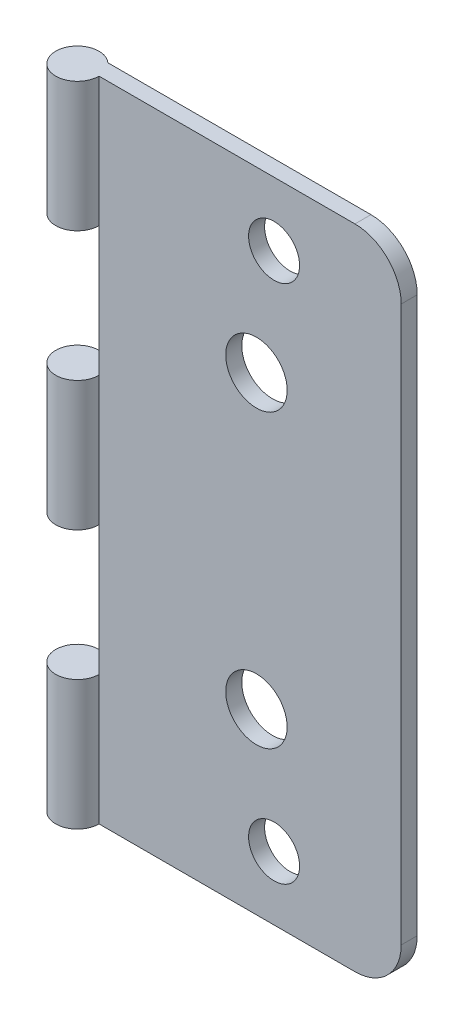
ISO-10303-21;
HEADER;
FILE_DESCRIPTION(('STEP AP214'),'2;1');
FILE_NAME('part.step','',(''),(''),'','','');
FILE_SCHEMA(('AUTOMOTIVE_DESIGN { 1 0 10303 214 1 1 1 1 }'));
ENDSEC;
DATA;
#1=APPLICATION_CONTEXT('core data for automotive mechanical design processes');
#2=APPLICATION_PROTOCOL_DEFINITION('international standard','automotive_design',2000,#1);
#3=PRODUCT_CONTEXT('',#1,'mechanical');
#4=PRODUCT('Part','Part','',(#3));
#5=PRODUCT_RELATED_PRODUCT_CATEGORY('part','',(#4));
#6=PRODUCT_DEFINITION_FORMATION('','',#4);
#7=PRODUCT_DEFINITION_CONTEXT('part definition',#1,'design');
#8=PRODUCT_DEFINITION('design','',#6,#7);
#9=PRODUCT_DEFINITION_SHAPE('','',#8);
#10=(LENGTH_UNIT() NAMED_UNIT(*) SI_UNIT(.MILLI.,.METRE.));
#11=(NAMED_UNIT(*) PLANE_ANGLE_UNIT() SI_UNIT($,.RADIAN.));
#12=(NAMED_UNIT(*) SI_UNIT($,.STERADIAN.) SOLID_ANGLE_UNIT());
#13=UNCERTAINTY_MEASURE_WITH_UNIT(LENGTH_MEASURE(1.E-05),#10,'distance_accuracy_value','');
#14=(GEOMETRIC_REPRESENTATION_CONTEXT(3) GLOBAL_UNCERTAINTY_ASSIGNED_CONTEXT((#13)) GLOBAL_UNIT_ASSIGNED_CONTEXT((#10,
#11,#12)) REPRESENTATION_CONTEXT('',''));
#15=CARTESIAN_POINT('',(0.,0.,0.));
#16=DIRECTION('',(0.,0.,1.));
#17=DIRECTION('',(1.,0.,0.));
#18=AXIS2_PLACEMENT_3D('',#15,#16,#17);
#19=CARTESIAN_POINT('',(0.,44.45,0.));
#20=DIRECTION('',(0.,-1.,0.));
#21=DIRECTION('',(0.,0.,-1.));
#22=AXIS2_PLACEMENT_3D('',#19,#20,#21);
#23=CYLINDRICAL_SURFACE('',#22,2.97);
#24=CARTESIAN_POINT('',(0.,8.89,0.));
#25=DIRECTION('',(0.,-1.,0.));
#26=DIRECTION('',(0.,0.,-1.));
#27=AXIS2_PLACEMENT_3D('',#24,#25,#26);
#28=CIRCLE('',#27,2.97);
#29=CARTESIAN_POINT('',(2.97,8.89,0.));
#30=VERTEX_POINT('',#29);
#31=CARTESIAN_POINT('',(1.99521928619388,8.89,-2.2));
#32=VERTEX_POINT('',#31);
#33=EDGE_CURVE('E237',#30,#32,#28,.T.);
#34=ORIENTED_EDGE('',*,*,#33,.T.);
#35=DIRECTION('',(0.,-1.,0.));
#36=VECTOR('',#35,1.);
#37=CARTESIAN_POINT('',(1.99521928619388,44.45,-2.2));
#38=LINE('',#37,#36);
#39=CARTESIAN_POINT('',(1.99521928619388,-8.89,-2.2));
#40=VERTEX_POINT('',#39);
#41=EDGE_CURVE('E266',#32,#40,#38,.T.);
#42=ORIENTED_EDGE('',*,*,#41,.T.);
#43=CARTESIAN_POINT('',(0.,-8.89,0.));
#44=DIRECTION('',(0.,1.,0.));
#45=DIRECTION('',(0.,0.,1.));
#46=AXIS2_PLACEMENT_3D('',#43,#44,#45);
#47=CIRCLE('',#46,2.97);
#48=CARTESIAN_POINT('',(2.97,-8.89,0.));
#49=VERTEX_POINT('',#48);
#50=EDGE_CURVE('E154',#40,#49,#47,.T.);
#51=ORIENTED_EDGE('',*,*,#50,.T.);
#52=DIRECTION('',(0.,-1.,0.));
#53=VECTOR('',#52,1.);
#54=CARTESIAN_POINT('',(2.97,44.45,0.));
#55=LINE('',#54,#53);
#56=EDGE_CURVE('E268',#30,#49,#55,.T.);
#57=ORIENTED_EDGE('',*,*,#56,.F.);
#58=EDGE_LOOP('',(#34,#42,#51,#57));
#59=FACE_BOUND('',#58,.T.);
#60=ADVANCED_FACE('F54',(#59),#23,.T.);
#61=CARTESIAN_POINT('',(0.,26.67,0.));
#62=DIRECTION('',(0.,1.,0.));
#63=DIRECTION('',(0.,0.,1.));
#64=AXIS2_PLACEMENT_3D('',#61,#62,#63);
#65=CIRCLE('',#64,2.97);
#66=CARTESIAN_POINT('',(1.99521928619388,26.67,-2.2));
#67=VERTEX_POINT('',#66);
#68=CARTESIAN_POINT('',(2.97,26.67,0.));
#69=VERTEX_POINT('',#68);
#70=EDGE_CURVE('E235',#67,#69,#65,.T.);
#71=ORIENTED_EDGE('',*,*,#70,.T.);
#72=CARTESIAN_POINT('',(2.97,44.45,0.));
#73=VERTEX_POINT('',#72);
#74=EDGE_CURVE('E160',#73,#69,#55,.T.);
#75=ORIENTED_EDGE('',*,*,#74,.F.);
#76=CARTESIAN_POINT('',(0.,44.45,0.));
#77=DIRECTION('',(0.,1.,0.));
#78=DIRECTION('',(0.,0.,1.));
#79=AXIS2_PLACEMENT_3D('',#76,#77,#78);
#80=CIRCLE('',#79,2.97);
#81=CARTESIAN_POINT('',(1.99521928619388,44.45,-2.2));
#82=VERTEX_POINT('',#81);
#83=EDGE_CURVE('E243',#82,#73,#80,.T.);
#84=ORIENTED_EDGE('',*,*,#83,.F.);
#85=EDGE_CURVE('E263',#82,#67,#38,.T.);
#86=ORIENTED_EDGE('',*,*,#85,.T.);
#87=EDGE_LOOP('',(#71,#75,#84,#86));
#88=FACE_BOUND('',#87,.T.);
#89=ADVANCED_FACE('F293',(#88),#23,.T.);
#90=CARTESIAN_POINT('',(0.,-26.67,0.));
#91=DIRECTION('',(0.,-1.,0.));
#92=DIRECTION('',(0.,0.,-1.));
#93=AXIS2_PLACEMENT_3D('',#90,#91,#92);
#94=CIRCLE('',#93,2.97);
#95=CARTESIAN_POINT('',(2.97,-26.67,0.));
#96=VERTEX_POINT('',#95);
#97=CARTESIAN_POINT('',(1.99521928619388,-26.67,-2.2));
#98=VERTEX_POINT('',#97);
#99=EDGE_CURVE('E232',#96,#98,#94,.T.);
#100=ORIENTED_EDGE('',*,*,#99,.T.);
#101=CARTESIAN_POINT('',(1.99521928619388,-44.45,-2.2));
#102=VERTEX_POINT('',#101);
#103=EDGE_CURVE('E246',#98,#102,#38,.T.);
#104=ORIENTED_EDGE('',*,*,#103,.T.);
#105=CARTESIAN_POINT('',(0.,-44.45,0.));
#106=DIRECTION('',(0.,1.,0.));
#107=DIRECTION('',(0.,0.,1.));
#108=AXIS2_PLACEMENT_3D('',#105,#106,#107);
#109=CIRCLE('',#108,2.97);
#110=CARTESIAN_POINT('',(2.97,-44.45,0.));
#111=VERTEX_POINT('',#110);
#112=EDGE_CURVE('E247',#102,#111,#109,.T.);
#113=ORIENTED_EDGE('',*,*,#112,.T.);
#114=EDGE_CURVE('E265',#96,#111,#55,.T.);
#115=ORIENTED_EDGE('',*,*,#114,.F.);
#116=EDGE_LOOP('',(#100,#104,#113,#115));
#117=FACE_BOUND('',#116,.T.);
#118=ADVANCED_FACE('F275',(#117),#23,.T.);
#119=CARTESIAN_POINT('',(0.,-44.45,0.));
#120=DIRECTION('',(0.,1.,0.));
#121=DIRECTION('',(0.,0.,1.));
#122=AXIS2_PLACEMENT_3D('',#119,#120,#121);
#123=PLANE('',#122);
#124=DIRECTION('',(1.,0.,0.));
#125=VECTOR('',#124,1.);
#126=CARTESIAN_POINT('',(0.,-44.45,-2.2));
#127=LINE('',#126,#125);
#128=CARTESIAN_POINT('',(38.1,-44.45,-2.2));
#129=VERTEX_POINT('',#128);
#130=EDGE_CURVE('E242',#102,#129,#127,.T.);
#131=ORIENTED_EDGE('',*,*,#130,.T.);
#132=DIRECTION('',(0.,0.,-1.));
#133=VECTOR('',#132,1.);
#134=CARTESIAN_POINT('',(38.1,-44.45,0.));
#135=LINE('',#134,#133);
#136=CARTESIAN_POINT('',(38.1,-44.45,0.));
#137=VERTEX_POINT('',#136);
#138=EDGE_CURVE('E79',#129,#137,#135,.F.);
#139=ORIENTED_EDGE('',*,*,#138,.T.);
#140=DIRECTION('',(1.,0.,0.));
#141=VECTOR('',#140,1.);
#142=CARTESIAN_POINT('',(0.,-44.45,0.));
#143=LINE('',#142,#141);
#144=EDGE_CURVE('E255',#111,#137,#143,.T.);
#145=ORIENTED_EDGE('',*,*,#144,.F.);
#146=ORIENTED_EDGE('',*,*,#112,.F.);
#147=EDGE_LOOP('',(#131,#139,#145,#146));
#148=FACE_BOUND('',#147,.T.);
#149=ADVANCED_FACE('F274',(#148),#123,.F.);
#150=CARTESIAN_POINT('',(0.,44.45,0.));
#151=DIRECTION('',(0.,1.,0.));
#152=DIRECTION('',(0.,0.,1.));
#153=AXIS2_PLACEMENT_3D('',#150,#151,#152);
#154=PLANE('',#153);
#155=DIRECTION('',(1.,0.,0.));
#156=VECTOR('',#155,1.);
#157=CARTESIAN_POINT('',(0.,44.45,0.));
#158=LINE('',#157,#156);
#159=CARTESIAN_POINT('',(38.1,44.45,0.));
#160=VERTEX_POINT('',#159);
#161=EDGE_CURVE('E254',#73,#160,#158,.T.);
#162=ORIENTED_EDGE('',*,*,#161,.T.);
#163=DIRECTION('',(0.,0.,-1.));
#164=VECTOR('',#163,1.);
#165=CARTESIAN_POINT('',(38.1,44.45,-2.2));
#166=LINE('',#165,#164);
#167=CARTESIAN_POINT('',(38.1,44.45,-2.2));
#168=VERTEX_POINT('',#167);
#169=EDGE_CURVE('E12',#160,#168,#166,.T.);
#170=ORIENTED_EDGE('',*,*,#169,.T.);
#171=DIRECTION('',(1.,0.,0.));
#172=VECTOR('',#171,1.);
#173=CARTESIAN_POINT('',(0.,44.45,-2.2));
#174=LINE('',#173,#172);
#175=EDGE_CURVE('E251',#82,#168,#174,.T.);
#176=ORIENTED_EDGE('',*,*,#175,.F.);
#177=ORIENTED_EDGE('',*,*,#83,.T.);
#178=EDGE_LOOP('',(#162,#170,#176,#177));
#179=FACE_BOUND('',#178,.T.);
#180=ADVANCED_FACE('F288',(#179),#154,.T.);
#181=CARTESIAN_POINT('',(0.,44.45,0.));
#182=DIRECTION('',(0.,0.,-1.));
#183=DIRECTION('',(-1.,0.,0.));
#184=AXIS2_PLACEMENT_3D('',#181,#182,#183);
#185=PLANE('',#184);
#186=CARTESIAN_POINT('',(24.58125,20.0103450185321,0.));
#187=DIRECTION('',(0.,0.,1.));
#188=DIRECTION('',(1.,0.,0.));
#189=AXIS2_PLACEMENT_3D('',#186,#187,#188);
#190=CIRCLE('',#189,4.21639999999999);
#191=CARTESIAN_POINT('',(28.79765,20.0103450185321,0.));
#192=VERTEX_POINT('',#191);
#193=EDGE_CURVE('E220',#192,#192,#190,.T.);
#194=ORIENTED_EDGE('',*,*,#193,.F.);
#195=EDGE_LOOP('',(#194));
#196=FACE_BOUND('',#195,.T.);
#197=CARTESIAN_POINT('',(24.58125,-20.0103450185321,0.));
#198=DIRECTION('',(0.,0.,1.));
#199=DIRECTION('',(1.,0.,0.));
#200=AXIS2_PLACEMENT_3D('',#197,#198,#199);
#201=CIRCLE('',#200,4.21639999999999);
#202=CARTESIAN_POINT('',(28.79765,-20.0103450185321,0.));
#203=VERTEX_POINT('',#202);
#204=EDGE_CURVE('E210',#203,#203,#201,.T.);
#205=ORIENTED_EDGE('',*,*,#204,.F.);
#206=EDGE_LOOP('',(#205));
#207=FACE_BOUND('',#206,.T.);
#208=CARTESIAN_POINT('',(27.,35.7,0.));
#209=DIRECTION('',(0.,0.,1.));
#210=DIRECTION('',(1.,0.,0.));
#211=AXIS2_PLACEMENT_3D('',#208,#209,#210);
#212=CIRCLE('',#211,3.5);
#213=CARTESIAN_POINT('',(30.5,35.7,0.));
#214=VERTEX_POINT('',#213);
#215=EDGE_CURVE('E205',#214,#214,#212,.T.);
#216=ORIENTED_EDGE('',*,*,#215,.F.);
#217=EDGE_LOOP('',(#216));
#218=FACE_BOUND('',#217,.T.);
#219=CARTESIAN_POINT('',(27.,-35.7,0.));
#220=DIRECTION('',(0.,0.,1.));
#221=DIRECTION('',(1.,0.,0.));
#222=AXIS2_PLACEMENT_3D('',#219,#220,#221);
#223=CIRCLE('',#222,3.5);
#224=CARTESIAN_POINT('',(30.5,-35.7,0.));
#225=VERTEX_POINT('',#224);
#226=EDGE_CURVE('E209',#225,#225,#223,.T.);
#227=ORIENTED_EDGE('',*,*,#226,.F.);
#228=EDGE_LOOP('',(#227));
#229=FACE_BOUND('',#228,.T.);
#230=ORIENTED_EDGE('',*,*,#144,.T.);
#231=CARTESIAN_POINT('',(38.1,-38.1,0.));
#232=DIRECTION('',(0.,0.,-1.));
#233=DIRECTION('',(-1.,0.,0.));
#234=AXIS2_PLACEMENT_3D('',#231,#232,#233);
#235=CIRCLE('',#234,6.35);
#236=CARTESIAN_POINT('',(44.45,-38.1,0.));
#237=VERTEX_POINT('',#236);
#238=EDGE_CURVE('E63',#137,#237,#235,.F.);
#239=ORIENTED_EDGE('',*,*,#238,.T.);
#240=DIRECTION('',(0.,-1.,0.));
#241=VECTOR('',#240,1.);
#242=CARTESIAN_POINT('',(44.45,44.45,0.));
#243=LINE('',#242,#241);
#244=CARTESIAN_POINT('',(44.45,38.1,0.));
#245=VERTEX_POINT('',#244);
#246=EDGE_CURVE('E250',#245,#237,#243,.T.);
#247=ORIENTED_EDGE('',*,*,#246,.F.);
#248=CARTESIAN_POINT('',(38.1,38.1,0.));
#249=DIRECTION('',(0.,0.,-1.));
#250=DIRECTION('',(-1.,0.,0.));
#251=AXIS2_PLACEMENT_3D('',#248,#249,#250);
#252=CIRCLE('',#251,6.35);
#253=EDGE_CURVE('E71',#245,#160,#252,.F.);
#254=ORIENTED_EDGE('',*,*,#253,.T.);
#255=ORIENTED_EDGE('',*,*,#161,.F.);
#256=ORIENTED_EDGE('',*,*,#74,.T.);
#257=DIRECTION('',(0.,-1.,0.));
#258=VECTOR('',#257,1.);
#259=CARTESIAN_POINT('',(2.97,44.45,0.));
#260=LINE('',#259,#258);
#261=EDGE_CURVE('E239',#69,#30,#260,.T.);
#262=ORIENTED_EDGE('',*,*,#261,.T.);
#263=ORIENTED_EDGE('',*,*,#56,.T.);
#264=DIRECTION('',(0.,-1.,0.));
#265=VECTOR('',#264,1.);
#266=CARTESIAN_POINT('',(2.96999999999999,44.45,0.));
#267=LINE('',#266,#265);
#268=EDGE_CURVE('E168',#49,#96,#267,.T.);
#269=ORIENTED_EDGE('',*,*,#268,.T.);
#270=ORIENTED_EDGE('',*,*,#114,.T.);
#271=EDGE_LOOP('',(#230,#239,#247,#254,#255,#256,#262,#263,#269,#270));
#272=FACE_BOUND('',#271,.T.);
#273=ADVANCED_FACE('F270',(#196,#207,#218,#229,#272),#185,.F.);
#274=CARTESIAN_POINT('',(44.45,44.45,0.));
#275=DIRECTION('',(-1.,0.,0.));
#276=DIRECTION('',(0.,0.,1.));
#277=AXIS2_PLACEMENT_3D('',#274,#275,#276);
#278=PLANE('',#277);
#279=ORIENTED_EDGE('',*,*,#246,.T.);
#280=DIRECTION('',(0.,0.,-1.));
#281=VECTOR('',#280,1.);
#282=CARTESIAN_POINT('',(44.45,-38.1,0.));
#283=LINE('',#282,#281);
#284=CARTESIAN_POINT('',(44.45,-38.1,-2.2));
#285=VERTEX_POINT('',#284);
#286=EDGE_CURVE('E191',#237,#285,#283,.T.);
#287=ORIENTED_EDGE('',*,*,#286,.T.);
#288=DIRECTION('',(0.,-1.,0.));
#289=VECTOR('',#288,1.);
#290=CARTESIAN_POINT('',(44.45,44.45,-2.2));
#291=LINE('',#290,#289);
#292=CARTESIAN_POINT('',(44.45,38.1,-2.2));
#293=VERTEX_POINT('',#292);
#294=EDGE_CURVE('E257',#293,#285,#291,.T.);
#295=ORIENTED_EDGE('',*,*,#294,.F.);
#296=DIRECTION('',(0.,0.,-1.));
#297=VECTOR('',#296,1.);
#298=CARTESIAN_POINT('',(44.45,38.1,0.));
#299=LINE('',#298,#297);
#300=EDGE_CURVE('E189',#293,#245,#299,.F.);
#301=ORIENTED_EDGE('',*,*,#300,.T.);
#302=EDGE_LOOP('',(#279,#287,#295,#301));
#303=FACE_BOUND('',#302,.T.);
#304=ADVANCED_FACE('F281',(#303),#278,.F.);
#305=CARTESIAN_POINT('',(0.,44.45,-2.2));
#306=DIRECTION('',(0.,0.,-1.));
#307=DIRECTION('',(-1.,0.,0.));
#308=AXIS2_PLACEMENT_3D('',#305,#306,#307);
#309=PLANE('',#308);
#310=CARTESIAN_POINT('',(24.58125,20.0103450185321,-2.2));
#311=DIRECTION('',(0.,0.,-1.));
#312=DIRECTION('',(-1.,0.,0.));
#313=AXIS2_PLACEMENT_3D('',#310,#311,#312);
#314=CIRCLE('',#313,4.21639999999999);
#315=CARTESIAN_POINT('',(20.36485,20.0103450185321,-2.2));
#316=VERTEX_POINT('',#315);
#317=EDGE_CURVE('E58',#316,#316,#314,.T.);
#318=ORIENTED_EDGE('',*,*,#317,.F.);
#319=EDGE_LOOP('',(#318));
#320=FACE_BOUND('',#319,.T.);
#321=CARTESIAN_POINT('',(24.58125,-20.0103450185321,-2.2));
#322=DIRECTION('',(0.,0.,-1.));
#323=DIRECTION('',(-1.,0.,0.));
#324=AXIS2_PLACEMENT_3D('',#321,#322,#323);
#325=CIRCLE('',#324,4.21639999999999);
#326=CARTESIAN_POINT('',(20.36485,-20.0103450185321,-2.2));
#327=VERTEX_POINT('',#326);
#328=EDGE_CURVE('E207',#327,#327,#325,.T.);
#329=ORIENTED_EDGE('',*,*,#328,.F.);
#330=EDGE_LOOP('',(#329));
#331=FACE_BOUND('',#330,.T.);
#332=CARTESIAN_POINT('',(27.,35.7,-2.2));
#333=DIRECTION('',(0.,0.,-1.));
#334=DIRECTION('',(-1.,0.,0.));
#335=AXIS2_PLACEMENT_3D('',#332,#333,#334);
#336=CIRCLE('',#335,3.5);
#337=CARTESIAN_POINT('',(23.5,35.7,-2.2));
#338=VERTEX_POINT('',#337);
#339=EDGE_CURVE('E204',#338,#338,#336,.T.);
#340=ORIENTED_EDGE('',*,*,#339,.F.);
#341=EDGE_LOOP('',(#340));
#342=FACE_BOUND('',#341,.T.);
#343=CARTESIAN_POINT('',(27.,-35.7,-2.2));
#344=DIRECTION('',(0.,0.,-1.));
#345=DIRECTION('',(-1.,0.,0.));
#346=AXIS2_PLACEMENT_3D('',#343,#344,#345);
#347=CIRCLE('',#346,3.5);
#348=CARTESIAN_POINT('',(23.5,-35.7,-2.2));
#349=VERTEX_POINT('',#348);
#350=EDGE_CURVE('E201',#349,#349,#347,.T.);
#351=ORIENTED_EDGE('',*,*,#350,.F.);
#352=EDGE_LOOP('',(#351));
#353=FACE_BOUND('',#352,.T.);
#354=ORIENTED_EDGE('',*,*,#294,.T.);
#355=CARTESIAN_POINT('',(38.1,-38.1,-2.2));
#356=DIRECTION('',(0.,0.,-1.));
#357=DIRECTION('',(-1.,0.,0.));
#358=AXIS2_PLACEMENT_3D('',#355,#356,#357);
#359=CIRCLE('',#358,6.35);
#360=EDGE_CURVE('E196',#285,#129,#359,.T.);
#361=ORIENTED_EDGE('',*,*,#360,.T.);
#362=ORIENTED_EDGE('',*,*,#130,.F.);
#363=ORIENTED_EDGE('',*,*,#103,.F.);
#364=DIRECTION('',(-1.,0.,0.));
#365=VECTOR('',#364,1.);
#366=CARTESIAN_POINT('',(0.,-26.67,-2.2));
#367=LINE('',#366,#365);
#368=CARTESIAN_POINT('',(2.97,-26.67,-2.2));
#369=VERTEX_POINT('',#368);
#370=EDGE_CURVE('E177',#369,#98,#367,.T.);
#371=ORIENTED_EDGE('',*,*,#370,.F.);
#372=DIRECTION('',(0.,-1.,0.));
#373=VECTOR('',#372,1.);
#374=CARTESIAN_POINT('',(2.96999999999999,44.45,-2.2));
#375=LINE('',#374,#373);
#376=CARTESIAN_POINT('',(2.97,-8.89,-2.2));
#377=VERTEX_POINT('',#376);
#378=EDGE_CURVE('E159',#377,#369,#375,.T.);
#379=ORIENTED_EDGE('',*,*,#378,.F.);
#380=DIRECTION('',(1.,0.,0.));
#381=VECTOR('',#380,1.);
#382=CARTESIAN_POINT('',(0.,-8.89,-2.2));
#383=LINE('',#382,#381);
#384=EDGE_CURVE('E149',#40,#377,#383,.T.);
#385=ORIENTED_EDGE('',*,*,#384,.F.);
#386=ORIENTED_EDGE('',*,*,#41,.F.);
#387=DIRECTION('',(-1.,0.,0.));
#388=VECTOR('',#387,1.);
#389=CARTESIAN_POINT('',(0.,8.89,-2.2));
#390=LINE('',#389,#388);
#391=CARTESIAN_POINT('',(2.97,8.89,-2.2));
#392=VERTEX_POINT('',#391);
#393=EDGE_CURVE('E186',#392,#32,#390,.T.);
#394=ORIENTED_EDGE('',*,*,#393,.F.);
#395=DIRECTION('',(0.,-1.,0.));
#396=VECTOR('',#395,1.);
#397=CARTESIAN_POINT('',(2.97,44.45,-2.2));
#398=LINE('',#397,#396);
#399=CARTESIAN_POINT('',(2.97,26.67,-2.2));
#400=VERTEX_POINT('',#399);
#401=EDGE_CURVE('E184',#400,#392,#398,.T.);
#402=ORIENTED_EDGE('',*,*,#401,.F.);
#403=DIRECTION('',(1.,0.,0.));
#404=VECTOR('',#403,1.);
#405=CARTESIAN_POINT('',(0.,26.67,-2.2));
#406=LINE('',#405,#404);
#407=EDGE_CURVE('E179',#67,#400,#406,.T.);
#408=ORIENTED_EDGE('',*,*,#407,.F.);
#409=ORIENTED_EDGE('',*,*,#85,.F.);
#410=ORIENTED_EDGE('',*,*,#175,.T.);
#411=CARTESIAN_POINT('',(38.1,38.1,-2.2));
#412=DIRECTION('',(0.,0.,-1.));
#413=DIRECTION('',(-1.,0.,0.));
#414=AXIS2_PLACEMENT_3D('',#411,#412,#413);
#415=CIRCLE('',#414,6.35);
#416=EDGE_CURVE('E194',#168,#293,#415,.T.);
#417=ORIENTED_EDGE('',*,*,#416,.T.);
#418=EDGE_LOOP('',(#354,#361,#362,#363,#371,#379,#385,#386,#394,#402,#408,#409,#410,#417));
#419=FACE_BOUND('',#418,.T.);
#420=ADVANCED_FACE('F174',(#320,#331,#342,#353,#419),#309,.T.);
#421=CARTESIAN_POINT('',(2.97,-8.89,-2.97));
#422=DIRECTION('',(1.,0.,0.));
#423=DIRECTION('',(0.,1.,0.));
#424=AXIS2_PLACEMENT_3D('',#421,#422,#423);
#425=PLANE('',#424);
#426=DIRECTION('',(0.,0.,1.));
#427=VECTOR('',#426,1.);
#428=CARTESIAN_POINT('',(2.97,-8.89,-2.97));
#429=LINE('',#428,#427);
#430=EDGE_CURVE('E152',#377,#49,#429,.T.);
#431=ORIENTED_EDGE('',*,*,#430,.F.);
#432=ORIENTED_EDGE('',*,*,#378,.T.);
#433=DIRECTION('',(0.,0.,1.));
#434=VECTOR('',#433,1.);
#435=CARTESIAN_POINT('',(2.97,-26.67,-2.97));
#436=LINE('',#435,#434);
#437=EDGE_CURVE('E170',#369,#96,#436,.T.);
#438=ORIENTED_EDGE('',*,*,#437,.T.);
#439=ORIENTED_EDGE('',*,*,#268,.F.);
#440=EDGE_LOOP('',(#431,#432,#438,#439));
#441=FACE_BOUND('',#440,.T.);
#442=ADVANCED_FACE('F164',(#441),#425,.F.);
#443=CARTESIAN_POINT('',(2.97,-26.67,-2.97));
#444=DIRECTION('',(0.,-1.,0.));
#445=DIRECTION('',(0.,0.,-1.));
#446=AXIS2_PLACEMENT_3D('',#443,#444,#445);
#447=PLANE('',#446);
#448=ORIENTED_EDGE('',*,*,#437,.F.);
#449=ORIENTED_EDGE('',*,*,#370,.T.);
#450=ORIENTED_EDGE('',*,*,#99,.F.);
#451=EDGE_LOOP('',(#448,#449,#450));
#452=FACE_BOUND('',#451,.T.);
#453=ADVANCED_FACE('F330',(#452),#447,.F.);
#454=CARTESIAN_POINT('',(2.97,-8.89,-2.97));
#455=DIRECTION('',(0.,1.,0.));
#456=DIRECTION('',(0.,0.,1.));
#457=AXIS2_PLACEMENT_3D('',#454,#455,#456);
#458=PLANE('',#457);
#459=ORIENTED_EDGE('',*,*,#50,.F.);
#460=ORIENTED_EDGE('',*,*,#384,.T.);
#461=ORIENTED_EDGE('',*,*,#430,.T.);
#462=EDGE_LOOP('',(#459,#460,#461));
#463=FACE_BOUND('',#462,.T.);
#464=ADVANCED_FACE('F151',(#463),#458,.F.);
#465=CARTESIAN_POINT('',(2.97,26.67,-2.97));
#466=DIRECTION('',(1.,0.,0.));
#467=DIRECTION('',(0.,1.,0.));
#468=AXIS2_PLACEMENT_3D('',#465,#466,#467);
#469=PLANE('',#468);
#470=DIRECTION('',(0.,0.,1.));
#471=VECTOR('',#470,1.);
#472=CARTESIAN_POINT('',(2.97,26.67,-2.97));
#473=LINE('',#472,#471);
#474=EDGE_CURVE('E169',#400,#69,#473,.T.);
#475=ORIENTED_EDGE('',*,*,#474,.F.);
#476=ORIENTED_EDGE('',*,*,#401,.T.);
#477=DIRECTION('',(0.,0.,1.));
#478=VECTOR('',#477,1.);
#479=CARTESIAN_POINT('',(2.97,8.89,-2.97));
#480=LINE('',#479,#478);
#481=EDGE_CURVE('E225',#392,#30,#480,.T.);
#482=ORIENTED_EDGE('',*,*,#481,.T.);
#483=ORIENTED_EDGE('',*,*,#261,.F.);
#484=EDGE_LOOP('',(#475,#476,#482,#483));
#485=FACE_BOUND('',#484,.T.);
#486=ADVANCED_FACE('F298',(#485),#469,.F.);
#487=CARTESIAN_POINT('',(2.97,8.89,-2.97));
#488=DIRECTION('',(0.,-1.,0.));
#489=DIRECTION('',(0.,0.,-1.));
#490=AXIS2_PLACEMENT_3D('',#487,#488,#489);
#491=PLANE('',#490);
#492=ORIENTED_EDGE('',*,*,#481,.F.);
#493=ORIENTED_EDGE('',*,*,#393,.T.);
#494=ORIENTED_EDGE('',*,*,#33,.F.);
#495=EDGE_LOOP('',(#492,#493,#494));
#496=FACE_BOUND('',#495,.T.);
#497=ADVANCED_FACE('F303',(#496),#491,.F.);
#498=CARTESIAN_POINT('',(2.97,26.67,-2.97));
#499=DIRECTION('',(0.,1.,0.));
#500=DIRECTION('',(0.,0.,1.));
#501=AXIS2_PLACEMENT_3D('',#498,#499,#500);
#502=PLANE('',#501);
#503=ORIENTED_EDGE('',*,*,#70,.F.);
#504=ORIENTED_EDGE('',*,*,#407,.T.);
#505=ORIENTED_EDGE('',*,*,#474,.T.);
#506=EDGE_LOOP('',(#503,#504,#505));
#507=FACE_BOUND('',#506,.T.);
#508=ADVANCED_FACE('F301',(#507),#502,.F.);
#509=CARTESIAN_POINT('',(38.1,-38.1,0.));
#510=DIRECTION('',(0.,0.,-1.));
#511=DIRECTION('',(-1.,0.,0.));
#512=AXIS2_PLACEMENT_3D('',#509,#510,#511);
#513=CYLINDRICAL_SURFACE('',#512,6.35);
#514=ORIENTED_EDGE('',*,*,#238,.F.);
#515=ORIENTED_EDGE('',*,*,#138,.F.);
#516=ORIENTED_EDGE('',*,*,#360,.F.);
#517=ORIENTED_EDGE('',*,*,#286,.F.);
#518=EDGE_LOOP('',(#514,#515,#516,#517));
#519=FACE_BOUND('',#518,.T.);
#520=ADVANCED_FACE('F278',(#519),#513,.T.);
#521=CARTESIAN_POINT('',(38.1,38.1,0.));
#522=DIRECTION('',(0.,0.,1.));
#523=DIRECTION('',(1.,0.,0.));
#524=AXIS2_PLACEMENT_3D('',#521,#522,#523);
#525=CYLINDRICAL_SURFACE('',#524,6.35);
#526=ORIENTED_EDGE('',*,*,#253,.F.);
#527=ORIENTED_EDGE('',*,*,#300,.F.);
#528=ORIENTED_EDGE('',*,*,#416,.F.);
#529=ORIENTED_EDGE('',*,*,#169,.F.);
#530=EDGE_LOOP('',(#526,#527,#528,#529));
#531=FACE_BOUND('',#530,.T.);
#532=ADVANCED_FACE('F56',(#531),#525,.T.);
#533=CARTESIAN_POINT('',(27.,-35.7,-2.97));
#534=DIRECTION('',(0.,0.,1.));
#535=DIRECTION('',(1.,0.,0.));
#536=AXIS2_PLACEMENT_3D('',#533,#534,#535);
#537=CYLINDRICAL_SURFACE('',#536,3.5);
#538=ORIENTED_EDGE('',*,*,#350,.T.);
#539=EDGE_LOOP('',(#538));
#540=FACE_BOUND('',#539,.T.);
#541=ORIENTED_EDGE('',*,*,#226,.T.);
#542=EDGE_LOOP('',(#541));
#543=FACE_BOUND('',#542,.T.);
#544=ADVANCED_FACE('F367',(#540,#543),#537,.F.);
#545=CARTESIAN_POINT('',(27.,35.7,-2.97));
#546=DIRECTION('',(0.,0.,1.));
#547=DIRECTION('',(1.,0.,0.));
#548=AXIS2_PLACEMENT_3D('',#545,#546,#547);
#549=CYLINDRICAL_SURFACE('',#548,3.5);
#550=ORIENTED_EDGE('',*,*,#339,.T.);
#551=EDGE_LOOP('',(#550));
#552=FACE_BOUND('',#551,.T.);
#553=ORIENTED_EDGE('',*,*,#215,.T.);
#554=EDGE_LOOP('',(#553));
#555=FACE_BOUND('',#554,.T.);
#556=ADVANCED_FACE('F375',(#552,#555),#549,.F.);
#557=CARTESIAN_POINT('',(24.58125,-20.0103450185321,0.));
#558=DIRECTION('',(0.,0.,1.));
#559=DIRECTION('',(1.,0.,0.));
#560=AXIS2_PLACEMENT_3D('',#557,#558,#559);
#561=CYLINDRICAL_SURFACE('',#560,4.21639999999999);
#562=ORIENTED_EDGE('',*,*,#328,.T.);
#563=EDGE_LOOP('',(#562));
#564=FACE_BOUND('',#563,.T.);
#565=ORIENTED_EDGE('',*,*,#204,.T.);
#566=EDGE_LOOP('',(#565));
#567=FACE_BOUND('',#566,.T.);
#568=ADVANCED_FACE('F385',(#564,#567),#561,.F.);
#569=CARTESIAN_POINT('',(24.58125,20.0103450185321,0.));
#570=DIRECTION('',(0.,0.,1.));
#571=DIRECTION('',(1.,0.,0.));
#572=AXIS2_PLACEMENT_3D('',#569,#570,#571);
#573=CYLINDRICAL_SURFACE('',#572,4.21639999999999);
#574=ORIENTED_EDGE('',*,*,#317,.T.);
#575=EDGE_LOOP('',(#574));
#576=FACE_BOUND('',#575,.T.);
#577=ORIENTED_EDGE('',*,*,#193,.T.);
#578=EDGE_LOOP('',(#577));
#579=FACE_BOUND('',#578,.T.);
#580=ADVANCED_FACE('F396',(#576,#579),#573,.F.);
#581=CLOSED_SHELL('',(#60,#89,#118,#149,#180,#273,#304,#420,#442,#453,#464,#486,#497,#508,#520,
#532,#544,#556,#568,#580));
#582=MANIFOLD_SOLID_BREP('B2',#581);
#583=ADVANCED_BREP_SHAPE_REPRESENTATION('',(#18,#582),#14);
#584=SHAPE_DEFINITION_REPRESENTATION(#9,#583);
ENDSEC;
END-ISO-10303-21;
